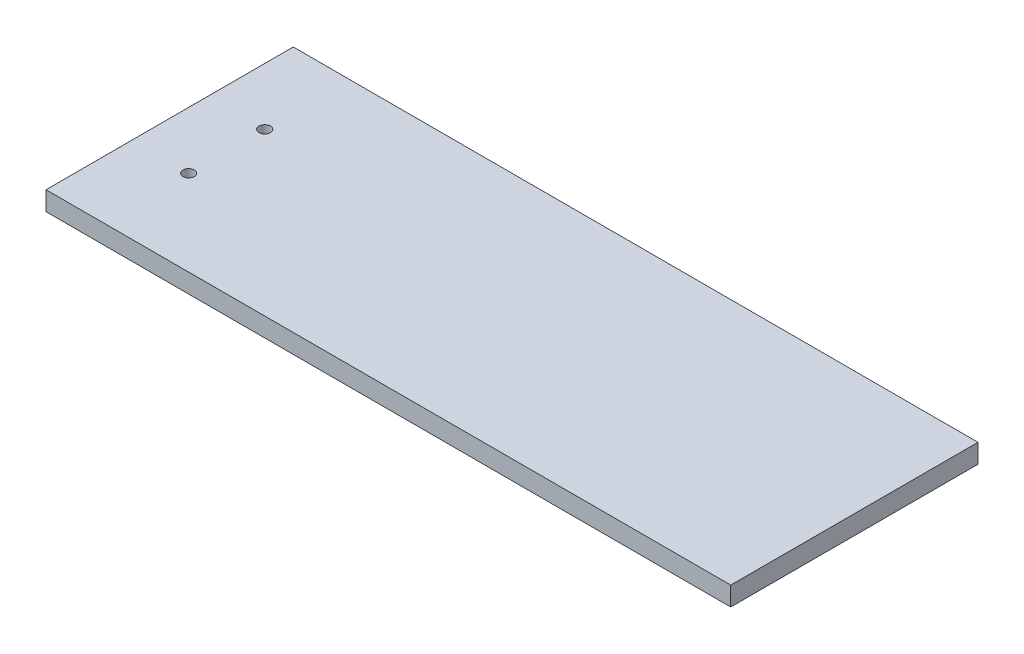
ISO-10303-21;
HEADER;
FILE_DESCRIPTION(('STEP AP214'),'2;1');
FILE_NAME('part.step','',(''),(''),'','','');
FILE_SCHEMA(('AUTOMOTIVE_DESIGN { 1 0 10303 214 1 1 1 1 }'));
ENDSEC;
DATA;
#1=APPLICATION_CONTEXT('core data for automotive mechanical design processes');
#2=APPLICATION_PROTOCOL_DEFINITION('international standard','automotive_design',2000,#1);
#3=PRODUCT_CONTEXT('',#1,'mechanical');
#4=PRODUCT('Part','Part','',(#3));
#5=PRODUCT_RELATED_PRODUCT_CATEGORY('part','',(#4));
#6=PRODUCT_DEFINITION_FORMATION('','',#4);
#7=PRODUCT_DEFINITION_CONTEXT('part definition',#1,'design');
#8=PRODUCT_DEFINITION('design','',#6,#7);
#9=PRODUCT_DEFINITION_SHAPE('','',#8);
#10=(LENGTH_UNIT() NAMED_UNIT(*) SI_UNIT(.MILLI.,.METRE.));
#11=(NAMED_UNIT(*) PLANE_ANGLE_UNIT() SI_UNIT($,.RADIAN.));
#12=(NAMED_UNIT(*) SI_UNIT($,.STERADIAN.) SOLID_ANGLE_UNIT());
#13=UNCERTAINTY_MEASURE_WITH_UNIT(LENGTH_MEASURE(1.E-05),#10,'distance_accuracy_value','');
#14=(GEOMETRIC_REPRESENTATION_CONTEXT(3) GLOBAL_UNCERTAINTY_ASSIGNED_CONTEXT((#13)) GLOBAL_UNIT_ASSIGNED_CONTEXT((#10,
#11,#12)) REPRESENTATION_CONTEXT('',''));
#15=CARTESIAN_POINT('',(0.,0.,0.));
#16=DIRECTION('',(0.,0.,1.));
#17=DIRECTION('',(1.,0.,0.));
#18=AXIS2_PLACEMENT_3D('',#15,#16,#17);
#19=CARTESIAN_POINT('',(102.980769230769,5.,35.7211538461538));
#20=DIRECTION('',(-1.,0.,0.));
#21=DIRECTION('',(0.,0.,1.));
#22=AXIS2_PLACEMENT_3D('',#19,#20,#21);
#23=PLANE('',#22);
#24=DIRECTION('',(0.,0.,-1.));
#25=VECTOR('',#24,1.);
#26=CARTESIAN_POINT('',(102.980769230769,0.,35.7211538461538));
#27=LINE('',#26,#25);
#28=CARTESIAN_POINT('',(102.980769230769,0.,35.7211538461538));
#29=VERTEX_POINT('',#28);
#30=CARTESIAN_POINT('',(102.980769230769,0.,-29.2788461538462));
#31=VERTEX_POINT('',#30);
#32=EDGE_CURVE('E100',#29,#31,#27,.T.);
#33=ORIENTED_EDGE('',*,*,#32,.T.);
#34=DIRECTION('',(0.,-1.,0.));
#35=VECTOR('',#34,1.);
#36=CARTESIAN_POINT('',(102.980769230769,5.,-29.2788461538462));
#37=LINE('',#36,#35);
#38=CARTESIAN_POINT('',(102.980769230769,5.,-29.2788461538462));
#39=VERTEX_POINT('',#38);
#40=EDGE_CURVE('E11',#39,#31,#37,.T.);
#41=ORIENTED_EDGE('',*,*,#40,.F.);
#42=DIRECTION('',(0.,0.,-1.));
#43=VECTOR('',#42,1.);
#44=CARTESIAN_POINT('',(102.980769230769,5.,35.7211538461538));
#45=LINE('',#44,#43);
#46=CARTESIAN_POINT('',(102.980769230769,5.,35.7211538461538));
#47=VERTEX_POINT('',#46);
#48=EDGE_CURVE('E88',#47,#39,#45,.T.);
#49=ORIENTED_EDGE('',*,*,#48,.F.);
#50=DIRECTION('',(0.,-1.,0.));
#51=VECTOR('',#50,1.);
#52=CARTESIAN_POINT('',(102.980769230769,5.,35.7211538461538));
#53=LINE('',#52,#51);
#54=EDGE_CURVE('E96',#47,#29,#53,.T.);
#55=ORIENTED_EDGE('',*,*,#54,.T.);
#56=EDGE_LOOP('',(#33,#41,#49,#55));
#57=FACE_BOUND('',#56,.T.);
#58=ADVANCED_FACE('F37',(#57),#23,.F.);
#59=CARTESIAN_POINT('',(-77.0192307692308,5.,-29.2788461538462));
#60=DIRECTION('',(0.,0.,1.));
#61=DIRECTION('',(1.,0.,0.));
#62=AXIS2_PLACEMENT_3D('',#59,#60,#61);
#63=PLANE('',#62);
#64=DIRECTION('',(-1.,0.,0.));
#65=VECTOR('',#64,1.);
#66=CARTESIAN_POINT('',(-77.0192307692308,0.,-29.2788461538462));
#67=LINE('',#66,#65);
#68=CARTESIAN_POINT('',(-77.0192307692308,0.,-29.2788461538462));
#69=VERTEX_POINT('',#68);
#70=EDGE_CURVE('E92',#31,#69,#67,.T.);
#71=ORIENTED_EDGE('',*,*,#70,.T.);
#72=DIRECTION('',(0.,-1.,0.));
#73=VECTOR('',#72,1.);
#74=CARTESIAN_POINT('',(-77.0192307692308,5.,-29.2788461538462));
#75=LINE('',#74,#73);
#76=CARTESIAN_POINT('',(-77.0192307692308,5.,-29.2788461538462));
#77=VERTEX_POINT('',#76);
#78=EDGE_CURVE('E45',#77,#69,#75,.T.);
#79=ORIENTED_EDGE('',*,*,#78,.F.);
#80=DIRECTION('',(-1.,0.,0.));
#81=VECTOR('',#80,1.);
#82=CARTESIAN_POINT('',(-77.0192307692308,5.,-29.2788461538462));
#83=LINE('',#82,#81);
#84=EDGE_CURVE('E83',#39,#77,#83,.T.);
#85=ORIENTED_EDGE('',*,*,#84,.F.);
#86=ORIENTED_EDGE('',*,*,#40,.T.);
#87=EDGE_LOOP('',(#71,#79,#85,#86));
#88=FACE_BOUND('',#87,.T.);
#89=ADVANCED_FACE('F91',(#88),#63,.F.);
#90=CARTESIAN_POINT('',(-77.0192307692308,5.,35.7211538461538));
#91=DIRECTION('',(1.,0.,0.));
#92=DIRECTION('',(0.,0.,-1.));
#93=AXIS2_PLACEMENT_3D('',#90,#91,#92);
#94=PLANE('',#93);
#95=DIRECTION('',(0.,0.,1.));
#96=VECTOR('',#95,1.);
#97=CARTESIAN_POINT('',(-77.0192307692308,0.,35.7211538461538));
#98=LINE('',#97,#96);
#99=CARTESIAN_POINT('',(-77.0192307692308,0.,35.7211538461538));
#100=VERTEX_POINT('',#99);
#101=EDGE_CURVE('E70',#69,#100,#98,.T.);
#102=ORIENTED_EDGE('',*,*,#101,.T.);
#103=DIRECTION('',(0.,-1.,0.));
#104=VECTOR('',#103,1.);
#105=CARTESIAN_POINT('',(-77.0192307692308,5.,35.7211538461538));
#106=LINE('',#105,#104);
#107=CARTESIAN_POINT('',(-77.0192307692308,5.,35.7211538461538));
#108=VERTEX_POINT('',#107);
#109=EDGE_CURVE('E93',#108,#100,#106,.T.);
#110=ORIENTED_EDGE('',*,*,#109,.F.);
#111=DIRECTION('',(0.,0.,1.));
#112=VECTOR('',#111,1.);
#113=CARTESIAN_POINT('',(-77.0192307692308,5.,35.7211538461538));
#114=LINE('',#113,#112);
#115=EDGE_CURVE('E86',#77,#108,#114,.T.);
#116=ORIENTED_EDGE('',*,*,#115,.F.);
#117=ORIENTED_EDGE('',*,*,#78,.T.);
#118=EDGE_LOOP('',(#102,#110,#116,#117));
#119=FACE_BOUND('',#118,.T.);
#120=ADVANCED_FACE('F94',(#119),#94,.F.);
#121=CARTESIAN_POINT('',(-77.0192307692308,5.,35.7211538461538));
#122=DIRECTION('',(0.,0.,-1.));
#123=DIRECTION('',(-1.,0.,0.));
#124=AXIS2_PLACEMENT_3D('',#121,#122,#123);
#125=PLANE('',#124);
#126=DIRECTION('',(1.,0.,0.));
#127=VECTOR('',#126,1.);
#128=CARTESIAN_POINT('',(-77.0192307692308,0.,35.7211538461538));
#129=LINE('',#128,#127);
#130=EDGE_CURVE('E76',#100,#29,#129,.T.);
#131=ORIENTED_EDGE('',*,*,#130,.T.);
#132=ORIENTED_EDGE('',*,*,#54,.F.);
#133=DIRECTION('',(1.,0.,0.));
#134=VECTOR('',#133,1.);
#135=CARTESIAN_POINT('',(-77.0192307692308,5.,35.7211538461538));
#136=LINE('',#135,#134);
#137=EDGE_CURVE('E53',#108,#47,#136,.T.);
#138=ORIENTED_EDGE('',*,*,#137,.F.);
#139=ORIENTED_EDGE('',*,*,#109,.T.);
#140=EDGE_LOOP('',(#131,#132,#138,#139));
#141=FACE_BOUND('',#140,.T.);
#142=ADVANCED_FACE('F108',(#141),#125,.F.);
#143=CARTESIAN_POINT('',(0.,5.,0.));
#144=DIRECTION('',(0.,-1.,0.));
#145=DIRECTION('',(0.,0.,-1.));
#146=AXIS2_PLACEMENT_3D('',#143,#144,#145);
#147=PLANE('',#146);
#148=CARTESIAN_POINT('',(-62.0192307692308,5.,-6.77884615384616));
#149=DIRECTION('',(0.,1.,0.));
#150=DIRECTION('',(0.,0.,1.));
#151=AXIS2_PLACEMENT_3D('',#148,#149,#150);
#152=CIRCLE('',#151,1.5);
#153=CARTESIAN_POINT('',(-62.0192307692308,5.,-5.27884615384616));
#154=VERTEX_POINT('',#153);
#155=EDGE_CURVE('E120',#154,#154,#152,.T.);
#156=ORIENTED_EDGE('',*,*,#155,.F.);
#157=EDGE_LOOP('',(#156));
#158=FACE_BOUND('',#157,.T.);
#159=CARTESIAN_POINT('',(-62.0192307692308,5.,13.2211538461538));
#160=DIRECTION('',(0.,1.,0.));
#161=DIRECTION('',(0.,0.,1.));
#162=AXIS2_PLACEMENT_3D('',#159,#160,#161);
#163=CIRCLE('',#162,1.5);
#164=CARTESIAN_POINT('',(-62.0192307692308,5.,14.7211538461539));
#165=VERTEX_POINT('',#164);
#166=EDGE_CURVE('E114',#165,#165,#163,.T.);
#167=ORIENTED_EDGE('',*,*,#166,.F.);
#168=EDGE_LOOP('',(#167));
#169=FACE_BOUND('',#168,.T.);
#170=ORIENTED_EDGE('',*,*,#48,.T.);
#171=ORIENTED_EDGE('',*,*,#84,.T.);
#172=ORIENTED_EDGE('',*,*,#115,.T.);
#173=ORIENTED_EDGE('',*,*,#137,.T.);
#174=EDGE_LOOP('',(#170,#171,#172,#173));
#175=FACE_BOUND('',#174,.T.);
#176=ADVANCED_FACE('F84',(#158,#169,#175),#147,.F.);
#177=CARTESIAN_POINT('',(0.,0.,0.));
#178=DIRECTION('',(0.,-1.,0.));
#179=DIRECTION('',(0.,0.,-1.));
#180=AXIS2_PLACEMENT_3D('',#177,#178,#179);
#181=PLANE('',#180);
#182=CARTESIAN_POINT('',(-62.0192307692308,0.,-6.77884615384616));
#183=DIRECTION('',(0.,1.,0.));
#184=DIRECTION('',(0.,0.,1.));
#185=AXIS2_PLACEMENT_3D('',#182,#183,#184);
#186=CIRCLE('',#185,1.5);
#187=CARTESIAN_POINT('',(-62.0192307692308,0.,-5.27884615384616));
#188=VERTEX_POINT('',#187);
#189=EDGE_CURVE('E103',#188,#188,#186,.T.);
#190=ORIENTED_EDGE('',*,*,#189,.T.);
#191=EDGE_LOOP('',(#190));
#192=FACE_BOUND('',#191,.T.);
#193=CARTESIAN_POINT('',(-62.0192307692308,0.,13.2211538461538));
#194=DIRECTION('',(0.,1.,0.));
#195=DIRECTION('',(0.,0.,1.));
#196=AXIS2_PLACEMENT_3D('',#193,#194,#195);
#197=CIRCLE('',#196,1.5);
#198=CARTESIAN_POINT('',(-62.0192307692308,0.,14.7211538461539));
#199=VERTEX_POINT('',#198);
#200=EDGE_CURVE('E117',#199,#199,#197,.T.);
#201=ORIENTED_EDGE('',*,*,#200,.T.);
#202=EDGE_LOOP('',(#201));
#203=FACE_BOUND('',#202,.T.);
#204=ORIENTED_EDGE('',*,*,#32,.F.);
#205=ORIENTED_EDGE('',*,*,#130,.F.);
#206=ORIENTED_EDGE('',*,*,#101,.F.);
#207=ORIENTED_EDGE('',*,*,#70,.F.);
#208=EDGE_LOOP('',(#204,#205,#206,#207));
#209=FACE_BOUND('',#208,.T.);
#210=ADVANCED_FACE('F111',(#192,#203,#209),#181,.T.);
#211=CARTESIAN_POINT('',(-62.0192307692308,0.,13.2211538461538));
#212=DIRECTION('',(0.,1.,0.));
#213=DIRECTION('',(0.,0.,1.));
#214=AXIS2_PLACEMENT_3D('',#211,#212,#213);
#215=CYLINDRICAL_SURFACE('',#214,1.5);
#216=ORIENTED_EDGE('',*,*,#200,.F.);
#217=EDGE_LOOP('',(#216));
#218=FACE_BOUND('',#217,.T.);
#219=ORIENTED_EDGE('',*,*,#166,.T.);
#220=EDGE_LOOP('',(#219));
#221=FACE_BOUND('',#220,.T.);
#222=ADVANCED_FACE('F131',(#218,#221),#215,.F.);
#223=CARTESIAN_POINT('',(-62.0192307692308,0.,-6.77884615384616));
#224=DIRECTION('',(0.,1.,0.));
#225=DIRECTION('',(0.,0.,1.));
#226=AXIS2_PLACEMENT_3D('',#223,#224,#225);
#227=CYLINDRICAL_SURFACE('',#226,1.5);
#228=ORIENTED_EDGE('',*,*,#189,.F.);
#229=EDGE_LOOP('',(#228));
#230=FACE_BOUND('',#229,.T.);
#231=ORIENTED_EDGE('',*,*,#155,.T.);
#232=EDGE_LOOP('',(#231));
#233=FACE_BOUND('',#232,.T.);
#234=ADVANCED_FACE('F128',(#230,#233),#227,.F.);
#235=CLOSED_SHELL('',(#58,#89,#120,#142,#176,#210,#222,#234));
#236=MANIFOLD_SOLID_BREP('B2',#235);
#237=ADVANCED_BREP_SHAPE_REPRESENTATION('',(#18,#236),#14);
#238=SHAPE_DEFINITION_REPRESENTATION(#9,#237);
ENDSEC;
END-ISO-10303-21;
